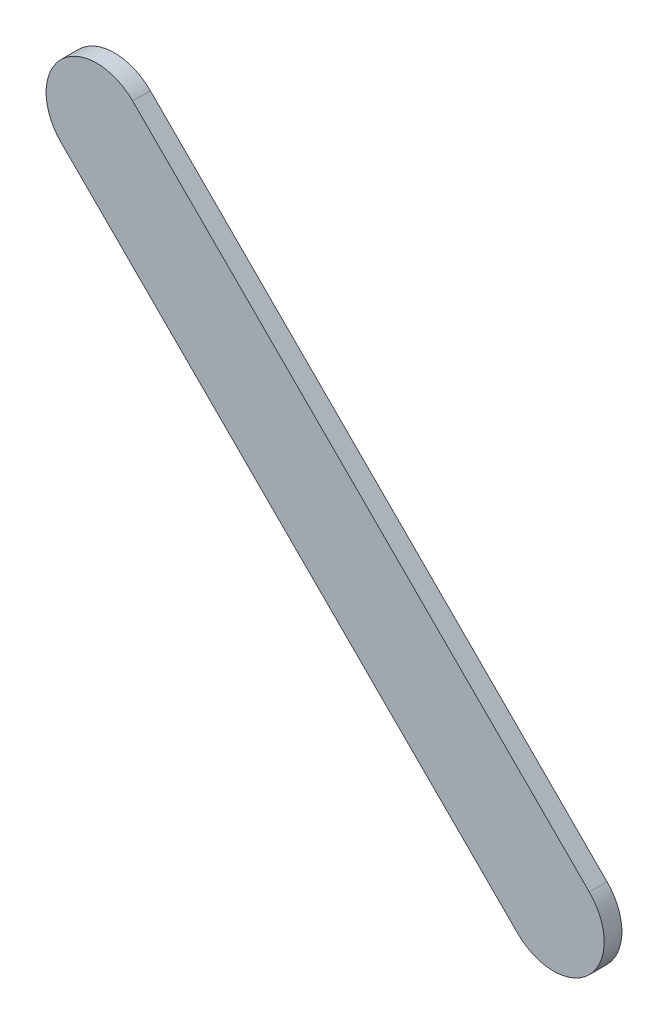
ISO-10303-21;
HEADER;
FILE_DESCRIPTION(('STEP AP214'),'2;1');
FILE_NAME('part.step','',(''),(''),'','','');
FILE_SCHEMA(('AUTOMOTIVE_DESIGN { 1 0 10303 214 1 1 1 1 }'));
ENDSEC;
DATA;
#1=APPLICATION_CONTEXT('core data for automotive mechanical design processes');
#2=APPLICATION_PROTOCOL_DEFINITION('international standard','automotive_design',2000,#1);
#3=PRODUCT_CONTEXT('',#1,'mechanical');
#4=PRODUCT('Part','Part','',(#3));
#5=PRODUCT_RELATED_PRODUCT_CATEGORY('part','',(#4));
#6=PRODUCT_DEFINITION_FORMATION('','',#4);
#7=PRODUCT_DEFINITION_CONTEXT('part definition',#1,'design');
#8=PRODUCT_DEFINITION('design','',#6,#7);
#9=PRODUCT_DEFINITION_SHAPE('','',#8);
#10=(LENGTH_UNIT() NAMED_UNIT(*) SI_UNIT(.MILLI.,.METRE.));
#11=(NAMED_UNIT(*) PLANE_ANGLE_UNIT() SI_UNIT($,.RADIAN.));
#12=(NAMED_UNIT(*) SI_UNIT($,.STERADIAN.) SOLID_ANGLE_UNIT());
#13=UNCERTAINTY_MEASURE_WITH_UNIT(LENGTH_MEASURE(1.E-05),#10,'distance_accuracy_value','');
#14=(GEOMETRIC_REPRESENTATION_CONTEXT(3) GLOBAL_UNCERTAINTY_ASSIGNED_CONTEXT((#13)) GLOBAL_UNIT_ASSIGNED_CONTEXT((#10,
#11,#12)) REPRESENTATION_CONTEXT('',''));
#15=CARTESIAN_POINT('',(0.,0.,0.));
#16=DIRECTION('',(0.,0.,1.));
#17=DIRECTION('',(1.,0.,0.));
#18=AXIS2_PLACEMENT_3D('',#15,#16,#17);
#19=CARTESIAN_POINT('',(88.411522,-125.12071,1.635));
#20=DIRECTION('',(0.,0.,1.));
#21=DIRECTION('',(1.,0.,0.));
#22=AXIS2_PLACEMENT_3D('',#19,#20,#21);
#23=PLANE('',#22);
#24=DIRECTION('',(0.707106781186548,-0.707106781186548,0.));
#25=VECTOR('',#24,1.);
#26=CARTESIAN_POINT('',(88.411522,-125.12071,1.635));
#27=LINE('',#26,#25);
#28=CARTESIAN_POINT('',(88.411522,-125.12071,1.635));
#29=VERTEX_POINT('',#28);
#30=CARTESIAN_POINT('',(89.312994,-126.022182,1.635));
#31=VERTEX_POINT('',#30);
#32=EDGE_CURVE('E71',#29,#31,#27,.T.);
#33=ORIENTED_EDGE('',*,*,#32,.T.);
#34=CARTESIAN_POINT('',(89.3837045,-125.9514715,1.635));
#35=DIRECTION('',(0.,0.,1.));
#36=DIRECTION('',(-0.707106781186048,-0.707106781187048,0.));
#37=AXIS2_PLACEMENT_3D('',#34,#35,#36);
#38=CIRCLE('',#37,0.09999974810218);
#39=CARTESIAN_POINT('',(89.454415,-125.880761,1.635));
#40=VERTEX_POINT('',#39);
#41=EDGE_CURVE('E69',#31,#40,#38,.T.);
#42=ORIENTED_EDGE('',*,*,#41,.T.);
#43=DIRECTION('',(-0.707106781186548,0.707106781186548,0.));
#44=VECTOR('',#43,1.);
#45=CARTESIAN_POINT('',(89.454415,-125.880761,1.635));
#46=LINE('',#45,#44);
#47=CARTESIAN_POINT('',(88.552943,-124.979289,1.635));
#48=VERTEX_POINT('',#47);
#49=EDGE_CURVE('E56',#40,#48,#46,.T.);
#50=ORIENTED_EDGE('',*,*,#49,.T.);
#51=CARTESIAN_POINT('',(88.4822325,-125.0499995,1.635));
#52=DIRECTION('',(0.,0.,1.));
#53=DIRECTION('',(0.707106781186048,0.707106781187047,0.));
#54=AXIS2_PLACEMENT_3D('',#51,#52,#53);
#55=CIRCLE('',#54,0.09999974810219);
#56=EDGE_CURVE('E11',#48,#29,#55,.T.);
#57=ORIENTED_EDGE('',*,*,#56,.T.);
#58=EDGE_LOOP('',(#33,#42,#50,#57));
#59=FACE_BOUND('',#58,.T.);
#60=ADVANCED_FACE('F17',(#59),#23,.T.);
#61=CARTESIAN_POINT('',(88.411522,-125.12071,1.6));
#62=DIRECTION('',(0.,0.,1.));
#63=DIRECTION('',(1.,0.,0.));
#64=AXIS2_PLACEMENT_3D('',#61,#62,#63);
#65=PLANE('',#64);
#66=CARTESIAN_POINT('',(88.4822325,-125.0499995,1.6));
#67=DIRECTION('',(0.,0.,1.));
#68=DIRECTION('',(0.707106781186048,0.707106781187047,0.));
#69=AXIS2_PLACEMENT_3D('',#66,#67,#68);
#70=CIRCLE('',#69,0.09999974810219);
#71=CARTESIAN_POINT('',(88.552943,-124.979289,1.6));
#72=VERTEX_POINT('',#71);
#73=CARTESIAN_POINT('',(88.411522,-125.12071,1.6));
#74=VERTEX_POINT('',#73);
#75=EDGE_CURVE('E26',#72,#74,#70,.T.);
#76=ORIENTED_EDGE('',*,*,#75,.F.);
#77=DIRECTION('',(-0.707106781186548,0.707106781186548,0.));
#78=VECTOR('',#77,1.);
#79=CARTESIAN_POINT('',(89.454415,-125.880761,1.6));
#80=LINE('',#79,#78);
#81=CARTESIAN_POINT('',(89.454415,-125.880761,1.6));
#82=VERTEX_POINT('',#81);
#83=EDGE_CURVE('E76',#82,#72,#80,.T.);
#84=ORIENTED_EDGE('',*,*,#83,.F.);
#85=CARTESIAN_POINT('',(89.3837045,-125.9514715,1.6));
#86=DIRECTION('',(0.,0.,1.));
#87=DIRECTION('',(-0.707106781186048,-0.707106781187048,0.));
#88=AXIS2_PLACEMENT_3D('',#85,#86,#87);
#89=CIRCLE('',#88,0.09999974810218);
#90=CARTESIAN_POINT('',(89.312994,-126.022182,1.6));
#91=VERTEX_POINT('',#90);
#92=EDGE_CURVE('E80',#91,#82,#89,.T.);
#93=ORIENTED_EDGE('',*,*,#92,.F.);
#94=DIRECTION('',(0.707106781186548,-0.707106781186548,0.));
#95=VECTOR('',#94,1.);
#96=CARTESIAN_POINT('',(88.411522,-125.12071,1.6));
#97=LINE('',#96,#95);
#98=EDGE_CURVE('E93',#74,#91,#97,.T.);
#99=ORIENTED_EDGE('',*,*,#98,.F.);
#100=EDGE_LOOP('',(#76,#84,#93,#99));
#101=FACE_BOUND('',#100,.T.);
#102=ADVANCED_FACE('F118',(#101),#65,.F.);
#103=CARTESIAN_POINT('',(88.4822325,-125.0499995,1.6));
#104=DIRECTION('',(0.,0.,-1.));
#105=DIRECTION('',(0.707106781186048,0.707106781187048,0.));
#106=AXIS2_PLACEMENT_3D('',#103,#104,#105);
#107=CYLINDRICAL_SURFACE('',#106,0.09999974810219);
#108=ORIENTED_EDGE('',*,*,#75,.T.);
#109=DIRECTION('',(0.,0.,1.));
#110=VECTOR('',#109,1.);
#111=CARTESIAN_POINT('',(88.411522,-125.12071,1.6));
#112=LINE('',#111,#110);
#113=EDGE_CURVE('E87',#74,#29,#112,.T.);
#114=ORIENTED_EDGE('',*,*,#113,.T.);
#115=ORIENTED_EDGE('',*,*,#56,.F.);
#116=DIRECTION('',(0.,0.,1.));
#117=VECTOR('',#116,1.);
#118=CARTESIAN_POINT('',(88.552943,-124.979289,1.6));
#119=LINE('',#118,#117);
#120=EDGE_CURVE('E63',#72,#48,#119,.T.);
#121=ORIENTED_EDGE('',*,*,#120,.F.);
#122=EDGE_LOOP('',(#108,#114,#115,#121));
#123=FACE_BOUND('',#122,.T.);
#124=ADVANCED_FACE('F110',(#123),#107,.T.);
#125=CARTESIAN_POINT('',(89.454415,-125.880761,1.6));
#126=DIRECTION('',(-0.707106781186548,-0.707106781186548,0.));
#127=DIRECTION('',(-0.707106781186548,0.707106781186548,0.));
#128=AXIS2_PLACEMENT_3D('',#125,#126,#127);
#129=PLANE('',#128);
#130=ORIENTED_EDGE('',*,*,#83,.T.);
#131=ORIENTED_EDGE('',*,*,#120,.T.);
#132=ORIENTED_EDGE('',*,*,#49,.F.);
#133=DIRECTION('',(0.,0.,1.));
#134=VECTOR('',#133,1.);
#135=CARTESIAN_POINT('',(89.454415,-125.880761,1.6));
#136=LINE('',#135,#134);
#137=EDGE_CURVE('E61',#82,#40,#136,.T.);
#138=ORIENTED_EDGE('',*,*,#137,.F.);
#139=EDGE_LOOP('',(#130,#131,#132,#138));
#140=FACE_BOUND('',#139,.T.);
#141=ADVANCED_FACE('F59',(#140),#129,.F.);
#142=CARTESIAN_POINT('',(89.3837045,-125.9514715,1.6));
#143=DIRECTION('',(0.,0.,-1.));
#144=DIRECTION('',(-0.707106781186048,-0.707106781187048,0.));
#145=AXIS2_PLACEMENT_3D('',#142,#143,#144);
#146=CYLINDRICAL_SURFACE('',#145,0.09999974810218);
#147=ORIENTED_EDGE('',*,*,#92,.T.);
#148=ORIENTED_EDGE('',*,*,#137,.T.);
#149=ORIENTED_EDGE('',*,*,#41,.F.);
#150=DIRECTION('',(0.,0.,1.));
#151=VECTOR('',#150,1.);
#152=CARTESIAN_POINT('',(89.312994,-126.022182,1.6));
#153=LINE('',#152,#151);
#154=EDGE_CURVE('E92',#91,#31,#153,.T.);
#155=ORIENTED_EDGE('',*,*,#154,.F.);
#156=EDGE_LOOP('',(#147,#148,#149,#155));
#157=FACE_BOUND('',#156,.T.);
#158=ADVANCED_FACE('F78',(#157),#146,.T.);
#159=CARTESIAN_POINT('',(88.411522,-125.12071,1.6));
#160=DIRECTION('',(0.707106781186548,0.707106781186548,0.));
#161=DIRECTION('',(0.,0.,-1.));
#162=AXIS2_PLACEMENT_3D('',#159,#160,#161);
#163=PLANE('',#162);
#164=ORIENTED_EDGE('',*,*,#98,.T.);
#165=ORIENTED_EDGE('',*,*,#154,.T.);
#166=ORIENTED_EDGE('',*,*,#32,.F.);
#167=ORIENTED_EDGE('',*,*,#113,.F.);
#168=EDGE_LOOP('',(#164,#165,#166,#167));
#169=FACE_BOUND('',#168,.T.);
#170=ADVANCED_FACE('F117',(#169),#163,.F.);
#171=CLOSED_SHELL('',(#60,#102,#124,#141,#158,#170));
#172=MANIFOLD_SOLID_BREP('B1',#171);
#173=ADVANCED_BREP_SHAPE_REPRESENTATION('',(#18,#172),#14);
#174=SHAPE_DEFINITION_REPRESENTATION(#9,#173);
ENDSEC;
END-ISO-10303-21;
